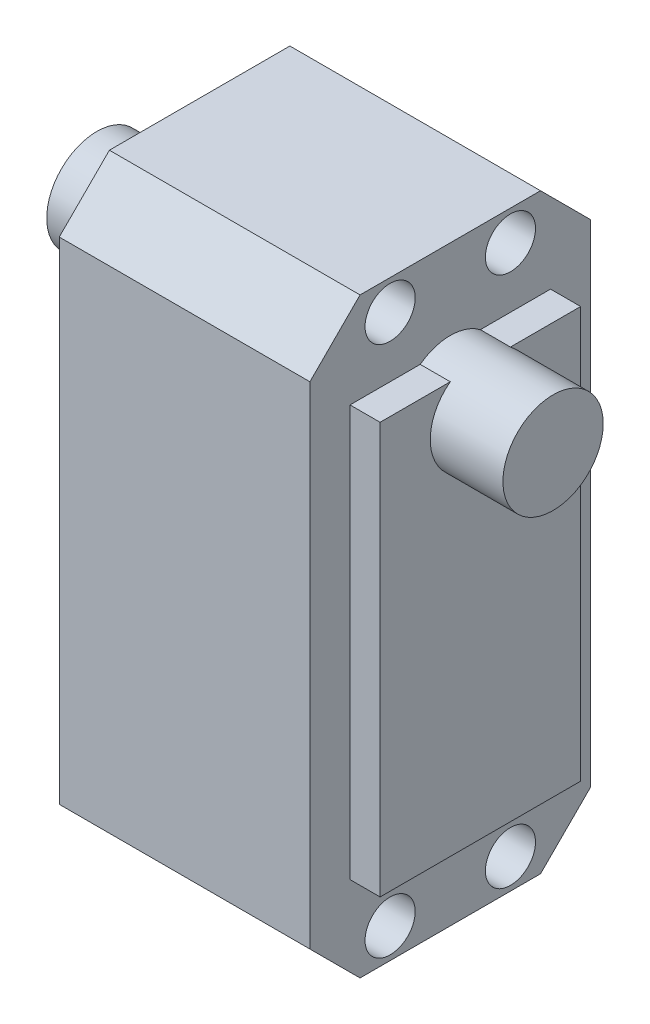
ISO-10303-21;
HEADER;
FILE_DESCRIPTION(('STEP AP214'),'2;1');
FILE_NAME('part.step','',(''),(''),'','','');
FILE_SCHEMA(('AUTOMOTIVE_DESIGN { 1 0 10303 214 1 1 1 1 }'));
ENDSEC;
DATA;
#1=APPLICATION_CONTEXT('core data for automotive mechanical design processes');
#2=APPLICATION_PROTOCOL_DEFINITION('international standard','automotive_design',2000,#1);
#3=PRODUCT_CONTEXT('',#1,'mechanical');
#4=PRODUCT('Part','Part','',(#3));
#5=PRODUCT_RELATED_PRODUCT_CATEGORY('part','',(#4));
#6=PRODUCT_DEFINITION_FORMATION('','',#4);
#7=PRODUCT_DEFINITION_CONTEXT('part definition',#1,'design');
#8=PRODUCT_DEFINITION('design','',#6,#7);
#9=PRODUCT_DEFINITION_SHAPE('','',#8);
#10=(LENGTH_UNIT() NAMED_UNIT(*) SI_UNIT(.MILLI.,.METRE.));
#11=(NAMED_UNIT(*) PLANE_ANGLE_UNIT() SI_UNIT($,.RADIAN.));
#12=(NAMED_UNIT(*) SI_UNIT($,.STERADIAN.) SOLID_ANGLE_UNIT());
#13=UNCERTAINTY_MEASURE_WITH_UNIT(LENGTH_MEASURE(1.E-05),#10,'distance_accuracy_value','');
#14=(GEOMETRIC_REPRESENTATION_CONTEXT(3) GLOBAL_UNCERTAINTY_ASSIGNED_CONTEXT((#13)) GLOBAL_UNIT_ASSIGNED_CONTEXT((#10,
#11,#12)) REPRESENTATION_CONTEXT('',''));
#15=CARTESIAN_POINT('',(0.,0.,0.));
#16=DIRECTION('',(0.,0.,1.));
#17=DIRECTION('',(1.,0.,0.));
#18=AXIS2_PLACEMENT_3D('',#15,#16,#17);
#19=CARTESIAN_POINT('',(0.,0.,2.8));
#20=DIRECTION('',(1.,0.,0.));
#21=DIRECTION('',(0.,0.,-1.));
#22=AXIS2_PLACEMENT_3D('',#19,#20,#21);
#23=PLANE('',#22);
#24=DIRECTION('',(0.,0.,-1.));
#25=VECTOR('',#24,1.);
#26=CARTESIAN_POINT('',(0.,0.2,0.));
#27=LINE('',#26,#25);
#28=CARTESIAN_POINT('',(0.,0.2,2.3));
#29=VERTEX_POINT('',#28);
#30=CARTESIAN_POINT('',(0.,0.2,0.5));
#31=VERTEX_POINT('',#30);
#32=EDGE_CURVE('E183',#29,#31,#27,.T.);
#33=ORIENTED_EDGE('',*,*,#32,.F.);
#34=DIRECTION('',(0.,-0.707106781186548,-0.707106781186548));
#35=VECTOR('',#34,1.);
#36=CARTESIAN_POINT('',(0.,0.7,2.8));
#37=LINE('',#36,#35);
#38=CARTESIAN_POINT('',(0.,0.7,2.8));
#39=VERTEX_POINT('',#38);
#40=EDGE_CURVE('E48',#39,#29,#37,.T.);
#41=ORIENTED_EDGE('',*,*,#40,.F.);
#42=DIRECTION('',(0.,-1.,0.));
#43=VECTOR('',#42,1.);
#44=CARTESIAN_POINT('',(0.,0.,2.8));
#45=LINE('',#44,#43);
#46=CARTESIAN_POINT('',(0.,5.6,2.8));
#47=VERTEX_POINT('',#46);
#48=EDGE_CURVE('E181',#47,#39,#45,.T.);
#49=ORIENTED_EDGE('',*,*,#48,.F.);
#50=DIRECTION('',(0.,-0.707106781186547,0.707106781186548));
#51=VECTOR('',#50,1.);
#52=CARTESIAN_POINT('',(0.,6.1,2.3));
#53=LINE('',#52,#51);
#54=CARTESIAN_POINT('',(0.,6.1,2.3));
#55=VERTEX_POINT('',#54);
#56=EDGE_CURVE('E250',#55,#47,#53,.T.);
#57=ORIENTED_EDGE('',*,*,#56,.F.);
#58=DIRECTION('',(0.,0.,1.));
#59=VECTOR('',#58,1.);
#60=CARTESIAN_POINT('',(0.,6.1,0.));
#61=LINE('',#60,#59);
#62=CARTESIAN_POINT('',(0.,6.1,0.5));
#63=VERTEX_POINT('',#62);
#64=EDGE_CURVE('E258',#63,#55,#61,.T.);
#65=ORIENTED_EDGE('',*,*,#64,.F.);
#66=DIRECTION('',(0.,0.707106781186547,0.707106781186548));
#67=VECTOR('',#66,1.);
#68=CARTESIAN_POINT('',(0.,6.1,0.5));
#69=LINE('',#68,#67);
#70=CARTESIAN_POINT('',(0.,5.6,0.));
#71=VERTEX_POINT('',#70);
#72=EDGE_CURVE('E243',#71,#63,#69,.T.);
#73=ORIENTED_EDGE('',*,*,#72,.F.);
#74=DIRECTION('',(0.,-1.,0.));
#75=VECTOR('',#74,1.);
#76=CARTESIAN_POINT('',(0.,0.,0.));
#77=LINE('',#76,#75);
#78=CARTESIAN_POINT('',(0.,0.7,0.));
#79=VERTEX_POINT('',#78);
#80=EDGE_CURVE('E194',#71,#79,#77,.T.);
#81=ORIENTED_EDGE('',*,*,#80,.T.);
#82=DIRECTION('',(0.,0.707106781186547,-0.707106781186548));
#83=VECTOR('',#82,1.);
#84=CARTESIAN_POINT('',(0.,0.7,0.));
#85=LINE('',#84,#83);
#86=EDGE_CURVE('E232',#31,#79,#85,.T.);
#87=ORIENTED_EDGE('',*,*,#86,.F.);
#88=EDGE_LOOP('',(#33,#41,#49,#57,#65,#73,#81,#87));
#89=FACE_BOUND('',#88,.T.);
#90=CARTESIAN_POINT('',(0.,0.5,2.));
#91=DIRECTION('',(-1.,0.,0.));
#92=DIRECTION('',(0.,0.,1.));
#93=AXIS2_PLACEMENT_3D('',#90,#91,#92);
#94=CIRCLE('',#93,0.25);
#95=CARTESIAN_POINT('',(0.,0.5,2.25));
#96=VERTEX_POINT('',#95);
#97=EDGE_CURVE('E206',#96,#96,#94,.T.);
#98=ORIENTED_EDGE('',*,*,#97,.F.);
#99=EDGE_LOOP('',(#98));
#100=FACE_BOUND('',#99,.T.);
#101=CARTESIAN_POINT('',(0.,0.5,0.8));
#102=DIRECTION('',(-1.,0.,0.));
#103=DIRECTION('',(0.,0.,1.));
#104=AXIS2_PLACEMENT_3D('',#101,#102,#103);
#105=CIRCLE('',#104,0.25);
#106=CARTESIAN_POINT('',(0.,0.5,1.05));
#107=VERTEX_POINT('',#106);
#108=EDGE_CURVE('E210',#107,#107,#105,.T.);
#109=ORIENTED_EDGE('',*,*,#108,.F.);
#110=EDGE_LOOP('',(#109));
#111=FACE_BOUND('',#110,.T.);
#112=CARTESIAN_POINT('',(0.,5.8,2.));
#113=DIRECTION('',(-1.,0.,0.));
#114=DIRECTION('',(0.,0.,1.));
#115=AXIS2_PLACEMENT_3D('',#112,#113,#114);
#116=CIRCLE('',#115,0.25);
#117=CARTESIAN_POINT('',(0.,5.8,2.25));
#118=VERTEX_POINT('',#117);
#119=EDGE_CURVE('E214',#118,#118,#116,.T.);
#120=ORIENTED_EDGE('',*,*,#119,.F.);
#121=EDGE_LOOP('',(#120));
#122=FACE_BOUND('',#121,.T.);
#123=CARTESIAN_POINT('',(0.,5.8,0.8));
#124=DIRECTION('',(-1.,0.,0.));
#125=DIRECTION('',(0.,0.,1.));
#126=AXIS2_PLACEMENT_3D('',#123,#124,#125);
#127=CIRCLE('',#126,0.25);
#128=CARTESIAN_POINT('',(0.,5.8,1.05));
#129=VERTEX_POINT('',#128);
#130=EDGE_CURVE('E218',#129,#129,#127,.T.);
#131=ORIENTED_EDGE('',*,*,#130,.F.);
#132=EDGE_LOOP('',(#131));
#133=FACE_BOUND('',#132,.T.);
#134=CARTESIAN_POINT('',(0.,4.8,1.4));
#135=DIRECTION('',(1.,0.,0.));
#136=DIRECTION('',(0.,0.,-1.));
#137=AXIS2_PLACEMENT_3D('',#134,#135,#136);
#138=CIRCLE('',#137,0.5);
#139=CARTESIAN_POINT('',(0.,5.2,1.7));
#140=VERTEX_POINT('',#139);
#141=CARTESIAN_POINT('',(0.,5.2,1.1));
#142=VERTEX_POINT('',#141);
#143=EDGE_CURVE('E274',#140,#142,#138,.F.);
#144=ORIENTED_EDGE('',*,*,#143,.F.);
#145=DIRECTION('',(0.,0.,-1.));
#146=VECTOR('',#145,1.);
#147=CARTESIAN_POINT('',(0.,5.2,0.4));
#148=LINE('',#147,#146);
#149=CARTESIAN_POINT('',(0.,5.2,2.4));
#150=VERTEX_POINT('',#149);
#151=EDGE_CURVE('E307',#150,#140,#148,.T.);
#152=ORIENTED_EDGE('',*,*,#151,.F.);
#153=DIRECTION('',(0.,1.,0.));
#154=VECTOR('',#153,1.);
#155=CARTESIAN_POINT('',(0.,5.2,2.4));
#156=LINE('',#155,#154);
#157=CARTESIAN_POINT('',(0.,1.1,2.4));
#158=VERTEX_POINT('',#157);
#159=EDGE_CURVE('E316',#158,#150,#156,.T.);
#160=ORIENTED_EDGE('',*,*,#159,.F.);
#161=DIRECTION('',(0.,0.,1.));
#162=VECTOR('',#161,1.);
#163=CARTESIAN_POINT('',(0.,1.1,0.400000000000001));
#164=LINE('',#163,#162);
#165=CARTESIAN_POINT('',(0.,1.1,0.400000000000001));
#166=VERTEX_POINT('',#165);
#167=EDGE_CURVE('E313',#166,#158,#164,.T.);
#168=ORIENTED_EDGE('',*,*,#167,.F.);
#169=DIRECTION('',(0.,-1.,0.));
#170=VECTOR('',#169,1.);
#171=CARTESIAN_POINT('',(0.,5.2,0.4));
#172=LINE('',#171,#170);
#173=CARTESIAN_POINT('',(0.,5.2,0.4));
#174=VERTEX_POINT('',#173);
#175=EDGE_CURVE('E310',#174,#166,#172,.T.);
#176=ORIENTED_EDGE('',*,*,#175,.F.);
#177=EDGE_CURVE('E205',#142,#174,#148,.T.);
#178=ORIENTED_EDGE('',*,*,#177,.F.);
#179=EDGE_LOOP('',(#144,#152,#160,#168,#176,#178));
#180=FACE_BOUND('',#179,.T.);
#181=ADVANCED_FACE('F34',(#89,#100,#111,#122,#133,#180),#23,.F.);
#182=CARTESIAN_POINT('',(2.5,0.,2.8));
#183=DIRECTION('',(-1.,0.,0.));
#184=DIRECTION('',(0.,0.,1.));
#185=AXIS2_PLACEMENT_3D('',#182,#183,#184);
#186=PLANE('',#185);
#187=DIRECTION('',(0.,1.,0.));
#188=VECTOR('',#187,1.);
#189=CARTESIAN_POINT('',(2.5,0.,2.8));
#190=LINE('',#189,#188);
#191=CARTESIAN_POINT('',(2.5,0.7,2.8));
#192=VERTEX_POINT('',#191);
#193=CARTESIAN_POINT('',(2.5,5.6,2.8));
#194=VERTEX_POINT('',#193);
#195=EDGE_CURVE('E189',#192,#194,#190,.T.);
#196=ORIENTED_EDGE('',*,*,#195,.F.);
#197=DIRECTION('',(0.,-0.707106781186548,-0.707106781186548));
#198=VECTOR('',#197,1.);
#199=CARTESIAN_POINT('',(2.5,0.35,2.45));
#200=LINE('',#199,#198);
#201=CARTESIAN_POINT('',(2.5,0.2,2.3));
#202=VERTEX_POINT('',#201);
#203=EDGE_CURVE('E171',#192,#202,#200,.T.);
#204=ORIENTED_EDGE('',*,*,#203,.T.);
#205=DIRECTION('',(0.,0.,-1.));
#206=VECTOR('',#205,1.);
#207=CARTESIAN_POINT('',(2.5,0.2,2.8));
#208=LINE('',#207,#206);
#209=CARTESIAN_POINT('',(2.5,0.2,0.5));
#210=VERTEX_POINT('',#209);
#211=EDGE_CURVE('E55',#202,#210,#208,.T.);
#212=ORIENTED_EDGE('',*,*,#211,.T.);
#213=DIRECTION('',(0.,0.707106781186547,-0.707106781186548));
#214=VECTOR('',#213,1.);
#215=CARTESIAN_POINT('',(2.5,-1.05,1.75));
#216=LINE('',#215,#214);
#217=CARTESIAN_POINT('',(2.5,0.7,0.));
#218=VERTEX_POINT('',#217);
#219=EDGE_CURVE('E234',#210,#218,#216,.T.);
#220=ORIENTED_EDGE('',*,*,#219,.T.);
#221=DIRECTION('',(0.,1.,0.));
#222=VECTOR('',#221,1.);
#223=CARTESIAN_POINT('',(2.5,0.,0.));
#224=LINE('',#223,#222);
#225=CARTESIAN_POINT('',(2.5,5.6,0.));
#226=VERTEX_POINT('',#225);
#227=EDGE_CURVE('E190',#218,#226,#224,.T.);
#228=ORIENTED_EDGE('',*,*,#227,.T.);
#229=DIRECTION('',(0.,0.707106781186547,0.707106781186548));
#230=VECTOR('',#229,1.);
#231=CARTESIAN_POINT('',(2.5,4.2,-1.4));
#232=LINE('',#231,#230);
#233=CARTESIAN_POINT('',(2.5,6.1,0.5));
#234=VERTEX_POINT('',#233);
#235=EDGE_CURVE('E247',#226,#234,#232,.T.);
#236=ORIENTED_EDGE('',*,*,#235,.T.);
#237=DIRECTION('',(0.,0.,1.));
#238=VECTOR('',#237,1.);
#239=CARTESIAN_POINT('',(2.5,6.1,2.8));
#240=LINE('',#239,#238);
#241=CARTESIAN_POINT('',(2.5,6.1,2.3));
#242=VERTEX_POINT('',#241);
#243=EDGE_CURVE('E260',#234,#242,#240,.T.);
#244=ORIENTED_EDGE('',*,*,#243,.T.);
#245=DIRECTION('',(0.,-0.707106781186547,0.707106781186548));
#246=VECTOR('',#245,1.);
#247=CARTESIAN_POINT('',(2.5,2.8,5.6));
#248=LINE('',#247,#246);
#249=EDGE_CURVE('E253',#242,#194,#248,.T.);
#250=ORIENTED_EDGE('',*,*,#249,.T.);
#251=EDGE_LOOP('',(#196,#204,#212,#220,#228,#236,#244,#250));
#252=FACE_BOUND('',#251,.T.);
#253=CARTESIAN_POINT('',(2.5,0.5,2.));
#254=DIRECTION('',(-1.,0.,0.));
#255=DIRECTION('',(0.,0.,1.));
#256=AXIS2_PLACEMENT_3D('',#253,#254,#255);
#257=CIRCLE('',#256,0.25);
#258=CARTESIAN_POINT('',(2.5,0.5,2.25));
#259=VERTEX_POINT('',#258);
#260=EDGE_CURVE('E202',#259,#259,#257,.T.);
#261=ORIENTED_EDGE('',*,*,#260,.T.);
#262=EDGE_LOOP('',(#261));
#263=FACE_BOUND('',#262,.T.);
#264=CARTESIAN_POINT('',(2.5,0.5,0.8));
#265=DIRECTION('',(-1.,0.,0.));
#266=DIRECTION('',(0.,0.,1.));
#267=AXIS2_PLACEMENT_3D('',#264,#265,#266);
#268=CIRCLE('',#267,0.25);
#269=CARTESIAN_POINT('',(2.5,0.5,1.05));
#270=VERTEX_POINT('',#269);
#271=EDGE_CURVE('E207',#270,#270,#268,.T.);
#272=ORIENTED_EDGE('',*,*,#271,.T.);
#273=EDGE_LOOP('',(#272));
#274=FACE_BOUND('',#273,.T.);
#275=CARTESIAN_POINT('',(2.5,5.8,2.));
#276=DIRECTION('',(-1.,0.,0.));
#277=DIRECTION('',(0.,0.,1.));
#278=AXIS2_PLACEMENT_3D('',#275,#276,#277);
#279=CIRCLE('',#278,0.25);
#280=CARTESIAN_POINT('',(2.5,5.8,2.25));
#281=VERTEX_POINT('',#280);
#282=EDGE_CURVE('E211',#281,#281,#279,.T.);
#283=ORIENTED_EDGE('',*,*,#282,.T.);
#284=EDGE_LOOP('',(#283));
#285=FACE_BOUND('',#284,.T.);
#286=CARTESIAN_POINT('',(2.5,5.8,0.8));
#287=DIRECTION('',(-1.,0.,0.));
#288=DIRECTION('',(0.,0.,1.));
#289=AXIS2_PLACEMENT_3D('',#286,#287,#288);
#290=CIRCLE('',#289,0.25);
#291=CARTESIAN_POINT('',(2.5,5.8,1.05));
#292=VERTEX_POINT('',#291);
#293=EDGE_CURVE('E215',#292,#292,#290,.T.);
#294=ORIENTED_EDGE('',*,*,#293,.T.);
#295=EDGE_LOOP('',(#294));
#296=FACE_BOUND('',#295,.T.);
#297=CARTESIAN_POINT('',(2.5,4.8,1.4));
#298=DIRECTION('',(-1.,0.,0.));
#299=DIRECTION('',(0.,0.,1.));
#300=AXIS2_PLACEMENT_3D('',#297,#298,#299);
#301=CIRCLE('',#300,0.5);
#302=CARTESIAN_POINT('',(2.5,5.2,1.1));
#303=VERTEX_POINT('',#302);
#304=CARTESIAN_POINT('',(2.5,5.2,1.7));
#305=VERTEX_POINT('',#304);
#306=EDGE_CURVE('E286',#303,#305,#301,.F.);
#307=ORIENTED_EDGE('',*,*,#306,.F.);
#308=DIRECTION('',(0.,0.,1.));
#309=VECTOR('',#308,1.);
#310=CARTESIAN_POINT('',(2.5,5.2,2.4));
#311=LINE('',#310,#309);
#312=CARTESIAN_POINT('',(2.5,5.2,0.4));
#313=VERTEX_POINT('',#312);
#314=EDGE_CURVE('E341',#313,#303,#311,.T.);
#315=ORIENTED_EDGE('',*,*,#314,.F.);
#316=DIRECTION('',(0.,1.,0.));
#317=VECTOR('',#316,1.);
#318=CARTESIAN_POINT('',(2.5,5.2,0.4));
#319=LINE('',#318,#317);
#320=CARTESIAN_POINT('',(2.5,1.1,0.399999999999999));
#321=VERTEX_POINT('',#320);
#322=EDGE_CURVE('E350',#321,#313,#319,.T.);
#323=ORIENTED_EDGE('',*,*,#322,.F.);
#324=DIRECTION('',(0.,0.,-1.));
#325=VECTOR('',#324,1.);
#326=CARTESIAN_POINT('',(2.5,1.1,2.4));
#327=LINE('',#326,#325);
#328=CARTESIAN_POINT('',(2.5,1.1,2.4));
#329=VERTEX_POINT('',#328);
#330=EDGE_CURVE('E347',#329,#321,#327,.T.);
#331=ORIENTED_EDGE('',*,*,#330,.F.);
#332=DIRECTION('',(0.,-1.,0.));
#333=VECTOR('',#332,1.);
#334=CARTESIAN_POINT('',(2.5,5.2,2.4));
#335=LINE('',#334,#333);
#336=CARTESIAN_POINT('',(2.5,5.2,2.4));
#337=VERTEX_POINT('',#336);
#338=EDGE_CURVE('E344',#337,#329,#335,.T.);
#339=ORIENTED_EDGE('',*,*,#338,.F.);
#340=EDGE_CURVE('E330',#305,#337,#311,.T.);
#341=ORIENTED_EDGE('',*,*,#340,.F.);
#342=EDGE_LOOP('',(#307,#315,#323,#331,#339,#341));
#343=FACE_BOUND('',#342,.T.);
#344=ADVANCED_FACE('F373',(#252,#263,#274,#285,#296,#343),#186,.F.);
#345=CARTESIAN_POINT('',(2.8,5.2,2.4));
#346=DIRECTION('',(0.,-1.,0.));
#347=DIRECTION('',(0.,0.,-1.));
#348=AXIS2_PLACEMENT_3D('',#345,#346,#347);
#349=PLANE('',#348);
#350=DIRECTION('',(-1.,0.,0.));
#351=VECTOR('',#350,1.);
#352=CARTESIAN_POINT('',(3.525,5.2,1.7));
#353=LINE('',#352,#351);
#354=CARTESIAN_POINT('',(2.8,5.2,1.7));
#355=VERTEX_POINT('',#354);
#356=EDGE_CURVE('E283',#305,#355,#353,.F.);
#357=ORIENTED_EDGE('',*,*,#356,.F.);
#358=ORIENTED_EDGE('',*,*,#340,.T.);
#359=DIRECTION('',(-1.,0.,0.));
#360=VECTOR('',#359,1.);
#361=CARTESIAN_POINT('',(2.8,5.2,2.4));
#362=LINE('',#361,#360);
#363=CARTESIAN_POINT('',(2.8,5.2,2.4));
#364=VERTEX_POINT('',#363);
#365=EDGE_CURVE('E197',#364,#337,#362,.T.);
#366=ORIENTED_EDGE('',*,*,#365,.F.);
#367=DIRECTION('',(0.,0.,1.));
#368=VECTOR('',#367,1.);
#369=CARTESIAN_POINT('',(2.8,5.2,2.4));
#370=LINE('',#369,#368);
#371=EDGE_CURVE('E334',#355,#364,#370,.T.);
#372=ORIENTED_EDGE('',*,*,#371,.F.);
#373=EDGE_LOOP('',(#357,#358,#366,#372));
#374=FACE_BOUND('',#373,.T.);
#375=ADVANCED_FACE('F370',(#374),#349,.F.);
#376=DIRECTION('',(-1.,0.,0.));
#377=VECTOR('',#376,1.);
#378=CARTESIAN_POINT('',(3.525,5.2,1.1));
#379=LINE('',#378,#377);
#380=CARTESIAN_POINT('',(2.8,5.2,1.1));
#381=VERTEX_POINT('',#380);
#382=EDGE_CURVE('E280',#381,#303,#379,.T.);
#383=ORIENTED_EDGE('',*,*,#382,.F.);
#384=CARTESIAN_POINT('',(2.8,5.2,0.4));
#385=VERTEX_POINT('',#384);
#386=EDGE_CURVE('E331',#385,#381,#370,.T.);
#387=ORIENTED_EDGE('',*,*,#386,.F.);
#388=DIRECTION('',(-1.,0.,0.));
#389=VECTOR('',#388,1.);
#390=CARTESIAN_POINT('',(2.8,5.2,0.4));
#391=LINE('',#390,#389);
#392=EDGE_CURVE('E340',#385,#313,#391,.T.);
#393=ORIENTED_EDGE('',*,*,#392,.T.);
#394=ORIENTED_EDGE('',*,*,#314,.T.);
#395=EDGE_LOOP('',(#383,#387,#393,#394));
#396=FACE_BOUND('',#395,.T.);
#397=ADVANCED_FACE('F387',(#396),#349,.F.);
#398=CARTESIAN_POINT('',(2.8,0.,0.));
#399=DIRECTION('',(-1.,0.,0.));
#400=DIRECTION('',(0.,0.,1.));
#401=AXIS2_PLACEMENT_3D('',#398,#399,#400);
#402=PLANE('',#401);
#403=CARTESIAN_POINT('',(2.8,4.8,1.4));
#404=DIRECTION('',(-1.,0.,0.));
#405=DIRECTION('',(0.,0.,1.));
#406=AXIS2_PLACEMENT_3D('',#403,#404,#405);
#407=CIRCLE('',#406,0.5);
#408=EDGE_CURVE('E277',#355,#381,#407,.F.);
#409=ORIENTED_EDGE('',*,*,#408,.F.);
#410=ORIENTED_EDGE('',*,*,#371,.T.);
#411=DIRECTION('',(0.,-1.,0.));
#412=VECTOR('',#411,1.);
#413=CARTESIAN_POINT('',(2.8,5.2,2.4));
#414=LINE('',#413,#412);
#415=CARTESIAN_POINT('',(2.8,1.1,2.4));
#416=VERTEX_POINT('',#415);
#417=EDGE_CURVE('E333',#364,#416,#414,.T.);
#418=ORIENTED_EDGE('',*,*,#417,.T.);
#419=DIRECTION('',(0.,0.,-1.));
#420=VECTOR('',#419,1.);
#421=CARTESIAN_POINT('',(2.8,1.1,2.4));
#422=LINE('',#421,#420);
#423=CARTESIAN_POINT('',(2.8,1.1,0.399999999999999));
#424=VERTEX_POINT('',#423);
#425=EDGE_CURVE('E336',#416,#424,#422,.T.);
#426=ORIENTED_EDGE('',*,*,#425,.T.);
#427=DIRECTION('',(0.,1.,0.));
#428=VECTOR('',#427,1.);
#429=CARTESIAN_POINT('',(2.8,5.2,0.4));
#430=LINE('',#429,#428);
#431=EDGE_CURVE('E338',#424,#385,#430,.T.);
#432=ORIENTED_EDGE('',*,*,#431,.T.);
#433=ORIENTED_EDGE('',*,*,#386,.T.);
#434=EDGE_LOOP('',(#409,#410,#418,#426,#432,#433));
#435=FACE_BOUND('',#434,.T.);
#436=ADVANCED_FACE('F382',(#435),#402,.F.);
#437=CARTESIAN_POINT('',(-0.3,5.2,0.4));
#438=DIRECTION('',(0.,-1.,0.));
#439=DIRECTION('',(0.,0.,-1.));
#440=AXIS2_PLACEMENT_3D('',#437,#438,#439);
#441=PLANE('',#440);
#442=DIRECTION('',(-1.,0.,0.));
#443=VECTOR('',#442,1.);
#444=CARTESIAN_POINT('',(3.525,5.2,1.7));
#445=LINE('',#444,#443);
#446=CARTESIAN_POINT('',(-0.3,5.2,1.7));
#447=VERTEX_POINT('',#446);
#448=EDGE_CURVE('E271',#447,#140,#445,.F.);
#449=ORIENTED_EDGE('',*,*,#448,.F.);
#450=DIRECTION('',(0.,0.,-1.));
#451=VECTOR('',#450,1.);
#452=CARTESIAN_POINT('',(-0.3,5.2,0.4));
#453=LINE('',#452,#451);
#454=CARTESIAN_POINT('',(-0.3,5.2,2.4));
#455=VERTEX_POINT('',#454);
#456=EDGE_CURVE('E297',#455,#447,#453,.T.);
#457=ORIENTED_EDGE('',*,*,#456,.F.);
#458=DIRECTION('',(1.,0.,0.));
#459=VECTOR('',#458,1.);
#460=CARTESIAN_POINT('',(-0.3,5.2,2.4));
#461=LINE('',#460,#459);
#462=EDGE_CURVE('E306',#455,#150,#461,.T.);
#463=ORIENTED_EDGE('',*,*,#462,.T.);
#464=ORIENTED_EDGE('',*,*,#151,.T.);
#465=EDGE_LOOP('',(#449,#457,#463,#464));
#466=FACE_BOUND('',#465,.T.);
#467=ADVANCED_FACE('F394',(#466),#441,.F.);
#468=DIRECTION('',(-1.,0.,0.));
#469=VECTOR('',#468,1.);
#470=CARTESIAN_POINT('',(3.525,5.2,1.1));
#471=LINE('',#470,#469);
#472=CARTESIAN_POINT('',(-0.3,5.2,1.1));
#473=VERTEX_POINT('',#472);
#474=EDGE_CURVE('E266',#142,#473,#471,.T.);
#475=ORIENTED_EDGE('',*,*,#474,.F.);
#476=ORIENTED_EDGE('',*,*,#177,.T.);
#477=DIRECTION('',(1.,0.,0.));
#478=VECTOR('',#477,1.);
#479=CARTESIAN_POINT('',(-0.3,5.2,0.4));
#480=LINE('',#479,#478);
#481=CARTESIAN_POINT('',(-0.3,5.2,0.4));
#482=VERTEX_POINT('',#481);
#483=EDGE_CURVE('E327',#482,#174,#480,.T.);
#484=ORIENTED_EDGE('',*,*,#483,.F.);
#485=EDGE_CURVE('E300',#473,#482,#453,.T.);
#486=ORIENTED_EDGE('',*,*,#485,.F.);
#487=EDGE_LOOP('',(#475,#476,#484,#486));
#488=FACE_BOUND('',#487,.T.);
#489=ADVANCED_FACE('F415',(#488),#441,.F.);
#490=CARTESIAN_POINT('',(-0.3,0.,0.));
#491=DIRECTION('',(1.,0.,0.));
#492=DIRECTION('',(0.,0.,-1.));
#493=AXIS2_PLACEMENT_3D('',#490,#491,#492);
#494=PLANE('',#493);
#495=CARTESIAN_POINT('',(-0.3,4.8,1.4));
#496=DIRECTION('',(1.,0.,0.));
#497=DIRECTION('',(0.,0.,-1.));
#498=AXIS2_PLACEMENT_3D('',#495,#496,#497);
#499=CIRCLE('',#498,0.5);
#500=EDGE_CURVE('E192',#473,#447,#499,.F.);
#501=ORIENTED_EDGE('',*,*,#500,.F.);
#502=ORIENTED_EDGE('',*,*,#485,.T.);
#503=DIRECTION('',(0.,-1.,0.));
#504=VECTOR('',#503,1.);
#505=CARTESIAN_POINT('',(-0.3,5.2,0.4));
#506=LINE('',#505,#504);
#507=CARTESIAN_POINT('',(-0.3,1.1,0.400000000000001));
#508=VERTEX_POINT('',#507);
#509=EDGE_CURVE('E299',#482,#508,#506,.T.);
#510=ORIENTED_EDGE('',*,*,#509,.T.);
#511=DIRECTION('',(0.,0.,1.));
#512=VECTOR('',#511,1.);
#513=CARTESIAN_POINT('',(-0.3,1.1,0.400000000000001));
#514=LINE('',#513,#512);
#515=CARTESIAN_POINT('',(-0.3,1.1,2.4));
#516=VERTEX_POINT('',#515);
#517=EDGE_CURVE('E302',#508,#516,#514,.T.);
#518=ORIENTED_EDGE('',*,*,#517,.T.);
#519=DIRECTION('',(0.,1.,0.));
#520=VECTOR('',#519,1.);
#521=CARTESIAN_POINT('',(-0.3,5.2,2.4));
#522=LINE('',#521,#520);
#523=EDGE_CURVE('E304',#516,#455,#522,.T.);
#524=ORIENTED_EDGE('',*,*,#523,.T.);
#525=ORIENTED_EDGE('',*,*,#456,.T.);
#526=EDGE_LOOP('',(#501,#502,#510,#518,#524,#525));
#527=FACE_BOUND('',#526,.T.);
#528=ADVANCED_FACE('F411',(#527),#494,.F.);
#529=CARTESIAN_POINT('',(0.,0.,2.8));
#530=DIRECTION('',(0.,0.,-1.));
#531=DIRECTION('',(-1.,0.,0.));
#532=AXIS2_PLACEMENT_3D('',#529,#530,#531);
#533=PLANE('',#532);
#534=ORIENTED_EDGE('',*,*,#48,.T.);
#535=DIRECTION('',(-1.,0.,0.));
#536=VECTOR('',#535,1.);
#537=CARTESIAN_POINT('',(10.,0.7,2.8));
#538=LINE('',#537,#536);
#539=EDGE_CURVE('E169',#192,#39,#538,.T.);
#540=ORIENTED_EDGE('',*,*,#539,.F.);
#541=ORIENTED_EDGE('',*,*,#195,.T.);
#542=DIRECTION('',(-1.,0.,0.));
#543=VECTOR('',#542,1.);
#544=CARTESIAN_POINT('',(10.,5.6,2.8));
#545=LINE('',#544,#543);
#546=EDGE_CURVE('E188',#194,#47,#545,.T.);
#547=ORIENTED_EDGE('',*,*,#546,.T.);
#548=EDGE_LOOP('',(#534,#540,#541,#547));
#549=FACE_BOUND('',#548,.T.);
#550=ADVANCED_FACE('F186',(#549),#533,.F.);
#551=CARTESIAN_POINT('',(0.,0.,0.));
#552=DIRECTION('',(0.,0.,-1.));
#553=DIRECTION('',(-1.,0.,0.));
#554=AXIS2_PLACEMENT_3D('',#551,#552,#553);
#555=PLANE('',#554);
#556=DIRECTION('',(-1.,0.,0.));
#557=VECTOR('',#556,1.);
#558=CARTESIAN_POINT('',(10.,0.7,0.));
#559=LINE('',#558,#557);
#560=EDGE_CURVE('E237',#218,#79,#559,.T.);
#561=ORIENTED_EDGE('',*,*,#560,.T.);
#562=ORIENTED_EDGE('',*,*,#80,.F.);
#563=DIRECTION('',(-1.,0.,0.));
#564=VECTOR('',#563,1.);
#565=CARTESIAN_POINT('',(10.,5.6,0.));
#566=LINE('',#565,#564);
#567=EDGE_CURVE('E245',#226,#71,#566,.T.);
#568=ORIENTED_EDGE('',*,*,#567,.F.);
#569=ORIENTED_EDGE('',*,*,#227,.F.);
#570=EDGE_LOOP('',(#561,#562,#568,#569));
#571=FACE_BOUND('',#570,.T.);
#572=ADVANCED_FACE('F408',(#571),#555,.T.);
#573=CARTESIAN_POINT('',(2.8,5.2,2.4));
#574=DIRECTION('',(0.,0.,-1.));
#575=DIRECTION('',(0.,1.,0.));
#576=AXIS2_PLACEMENT_3D('',#573,#574,#575);
#577=PLANE('',#576);
#578=ORIENTED_EDGE('',*,*,#338,.T.);
#579=DIRECTION('',(-1.,0.,0.));
#580=VECTOR('',#579,1.);
#581=CARTESIAN_POINT('',(2.8,1.1,2.4));
#582=LINE('',#581,#580);
#583=EDGE_CURVE('E357',#416,#329,#582,.T.);
#584=ORIENTED_EDGE('',*,*,#583,.F.);
#585=ORIENTED_EDGE('',*,*,#417,.F.);
#586=ORIENTED_EDGE('',*,*,#365,.T.);
#587=EDGE_LOOP('',(#578,#584,#585,#586));
#588=FACE_BOUND('',#587,.T.);
#589=ADVANCED_FACE('F366',(#588),#577,.F.);
#590=CARTESIAN_POINT('',(2.8,1.1,2.4));
#591=DIRECTION('',(0.,1.,0.));
#592=DIRECTION('',(0.,0.,1.));
#593=AXIS2_PLACEMENT_3D('',#590,#591,#592);
#594=PLANE('',#593);
#595=ORIENTED_EDGE('',*,*,#330,.T.);
#596=DIRECTION('',(-1.,0.,0.));
#597=VECTOR('',#596,1.);
#598=CARTESIAN_POINT('',(2.8,1.1,0.399999999999999));
#599=LINE('',#598,#597);
#600=EDGE_CURVE('E355',#424,#321,#599,.T.);
#601=ORIENTED_EDGE('',*,*,#600,.F.);
#602=ORIENTED_EDGE('',*,*,#425,.F.);
#603=ORIENTED_EDGE('',*,*,#583,.T.);
#604=EDGE_LOOP('',(#595,#601,#602,#603));
#605=FACE_BOUND('',#604,.T.);
#606=ADVANCED_FACE('F375',(#605),#594,.F.);
#607=CARTESIAN_POINT('',(2.8,5.2,0.4));
#608=DIRECTION('',(0.,0.,1.));
#609=DIRECTION('',(0.,-1.,0.));
#610=AXIS2_PLACEMENT_3D('',#607,#608,#609);
#611=PLANE('',#610);
#612=ORIENTED_EDGE('',*,*,#322,.T.);
#613=ORIENTED_EDGE('',*,*,#392,.F.);
#614=ORIENTED_EDGE('',*,*,#431,.F.);
#615=ORIENTED_EDGE('',*,*,#600,.T.);
#616=EDGE_LOOP('',(#612,#613,#614,#615));
#617=FACE_BOUND('',#616,.T.);
#618=ADVANCED_FACE('F378',(#617),#611,.F.);
#619=CARTESIAN_POINT('',(-0.3,5.2,0.4));
#620=DIRECTION('',(0.,0.,1.));
#621=DIRECTION('',(0.,-1.,0.));
#622=AXIS2_PLACEMENT_3D('',#619,#620,#621);
#623=PLANE('',#622);
#624=ORIENTED_EDGE('',*,*,#175,.T.);
#625=DIRECTION('',(1.,0.,0.));
#626=VECTOR('',#625,1.);
#627=CARTESIAN_POINT('',(-0.3,1.1,0.400000000000001));
#628=LINE('',#627,#626);
#629=EDGE_CURVE('E324',#508,#166,#628,.T.);
#630=ORIENTED_EDGE('',*,*,#629,.F.);
#631=ORIENTED_EDGE('',*,*,#509,.F.);
#632=ORIENTED_EDGE('',*,*,#483,.T.);
#633=EDGE_LOOP('',(#624,#630,#631,#632));
#634=FACE_BOUND('',#633,.T.);
#635=ADVANCED_FACE('F434',(#634),#623,.F.);
#636=CARTESIAN_POINT('',(-0.3,1.1,0.400000000000001));
#637=DIRECTION('',(0.,1.,0.));
#638=DIRECTION('',(0.,0.,1.));
#639=AXIS2_PLACEMENT_3D('',#636,#637,#638);
#640=PLANE('',#639);
#641=ORIENTED_EDGE('',*,*,#167,.T.);
#642=DIRECTION('',(1.,0.,0.));
#643=VECTOR('',#642,1.);
#644=CARTESIAN_POINT('',(-0.3,1.1,2.4));
#645=LINE('',#644,#643);
#646=EDGE_CURVE('E321',#516,#158,#645,.T.);
#647=ORIENTED_EDGE('',*,*,#646,.F.);
#648=ORIENTED_EDGE('',*,*,#517,.F.);
#649=ORIENTED_EDGE('',*,*,#629,.T.);
#650=EDGE_LOOP('',(#641,#647,#648,#649));
#651=FACE_BOUND('',#650,.T.);
#652=ADVANCED_FACE('F430',(#651),#640,.F.);
#653=CARTESIAN_POINT('',(-0.3,5.2,2.4));
#654=DIRECTION('',(0.,0.,-1.));
#655=DIRECTION('',(0.,1.,0.));
#656=AXIS2_PLACEMENT_3D('',#653,#654,#655);
#657=PLANE('',#656);
#658=ORIENTED_EDGE('',*,*,#159,.T.);
#659=ORIENTED_EDGE('',*,*,#462,.F.);
#660=ORIENTED_EDGE('',*,*,#523,.F.);
#661=ORIENTED_EDGE('',*,*,#646,.T.);
#662=EDGE_LOOP('',(#658,#659,#660,#661));
#663=FACE_BOUND('',#662,.T.);
#664=ADVANCED_FACE('F427',(#663),#657,.F.);
#665=CARTESIAN_POINT('',(10.3,0.5,2.));
#666=DIRECTION('',(-1.,0.,0.));
#667=DIRECTION('',(0.,0.,1.));
#668=AXIS2_PLACEMENT_3D('',#665,#666,#667);
#669=CYLINDRICAL_SURFACE('',#668,0.25);
#670=ORIENTED_EDGE('',*,*,#97,.T.);
#671=EDGE_LOOP('',(#670));
#672=FACE_BOUND('',#671,.T.);
#673=ORIENTED_EDGE('',*,*,#260,.F.);
#674=EDGE_LOOP('',(#673));
#675=FACE_BOUND('',#674,.T.);
#676=ADVANCED_FACE('F425',(#672,#675),#669,.F.);
#677=CARTESIAN_POINT('',(10.3,0.5,0.8));
#678=DIRECTION('',(-1.,0.,0.));
#679=DIRECTION('',(0.,0.,1.));
#680=AXIS2_PLACEMENT_3D('',#677,#678,#679);
#681=CYLINDRICAL_SURFACE('',#680,0.25);
#682=ORIENTED_EDGE('',*,*,#108,.T.);
#683=EDGE_LOOP('',(#682));
#684=FACE_BOUND('',#683,.T.);
#685=ORIENTED_EDGE('',*,*,#271,.F.);
#686=EDGE_LOOP('',(#685));
#687=FACE_BOUND('',#686,.T.);
#688=ADVANCED_FACE('F476',(#684,#687),#681,.F.);
#689=CARTESIAN_POINT('',(10.3,5.8,2.));
#690=DIRECTION('',(-1.,0.,0.));
#691=DIRECTION('',(0.,0.,1.));
#692=AXIS2_PLACEMENT_3D('',#689,#690,#691);
#693=CYLINDRICAL_SURFACE('',#692,0.25);
#694=ORIENTED_EDGE('',*,*,#119,.T.);
#695=EDGE_LOOP('',(#694));
#696=FACE_BOUND('',#695,.T.);
#697=ORIENTED_EDGE('',*,*,#282,.F.);
#698=EDGE_LOOP('',(#697));
#699=FACE_BOUND('',#698,.T.);
#700=ADVANCED_FACE('F483',(#696,#699),#693,.F.);
#701=CARTESIAN_POINT('',(10.3,5.8,0.8));
#702=DIRECTION('',(-1.,0.,0.));
#703=DIRECTION('',(0.,0.,1.));
#704=AXIS2_PLACEMENT_3D('',#701,#702,#703);
#705=CYLINDRICAL_SURFACE('',#704,0.25);
#706=ORIENTED_EDGE('',*,*,#130,.T.);
#707=EDGE_LOOP('',(#706));
#708=FACE_BOUND('',#707,.T.);
#709=ORIENTED_EDGE('',*,*,#293,.F.);
#710=EDGE_LOOP('',(#709));
#711=FACE_BOUND('',#710,.T.);
#712=ADVANCED_FACE('F490',(#708,#711),#705,.F.);
#713=CARTESIAN_POINT('',(-1.025,4.8,1.4));
#714=DIRECTION('',(1.,0.,0.));
#715=DIRECTION('',(0.,0.,-1.));
#716=AXIS2_PLACEMENT_3D('',#713,#714,#715);
#717=PLANE('',#716);
#718=CARTESIAN_POINT('',(-1.025,4.8,1.4));
#719=DIRECTION('',(1.,0.,0.));
#720=DIRECTION('',(0.,0.,-1.));
#721=AXIS2_PLACEMENT_3D('',#718,#719,#720);
#722=CIRCLE('',#721,0.5);
#723=CARTESIAN_POINT('',(-1.025,4.8,0.9));
#724=VERTEX_POINT('',#723);
#725=EDGE_CURVE('E262',#724,#724,#722,.T.);
#726=ORIENTED_EDGE('',*,*,#725,.F.);
#727=EDGE_LOOP('',(#726));
#728=FACE_BOUND('',#727,.T.);
#729=ADVANCED_FACE('F498',(#728),#717,.F.);
#730=CARTESIAN_POINT('',(3.525,4.8,1.4));
#731=DIRECTION('',(-1.,0.,0.));
#732=DIRECTION('',(0.,0.,1.));
#733=AXIS2_PLACEMENT_3D('',#730,#731,#732);
#734=CYLINDRICAL_SURFACE('',#733,0.5);
#735=ORIENTED_EDGE('',*,*,#725,.T.);
#736=EDGE_LOOP('',(#735));
#737=FACE_BOUND('',#736,.T.);
#738=ORIENTED_EDGE('',*,*,#448,.T.);
#739=ORIENTED_EDGE('',*,*,#143,.T.);
#740=ORIENTED_EDGE('',*,*,#474,.T.);
#741=ORIENTED_EDGE('',*,*,#500,.T.);
#742=EDGE_LOOP('',(#738,#739,#740,#741));
#743=FACE_BOUND('',#742,.T.);
#744=ADVANCED_FACE('F507',(#737,#743),#734,.T.);
#745=CARTESIAN_POINT('',(3.525,4.8,1.4));
#746=DIRECTION('',(1.,0.,0.));
#747=DIRECTION('',(0.,0.,-1.));
#748=AXIS2_PLACEMENT_3D('',#745,#746,#747);
#749=CIRCLE('',#748,0.5);
#750=CARTESIAN_POINT('',(3.525,4.8,0.9));
#751=VERTEX_POINT('',#750);
#752=EDGE_CURVE('E263',#751,#751,#749,.T.);
#753=ORIENTED_EDGE('',*,*,#752,.F.);
#754=EDGE_LOOP('',(#753));
#755=FACE_BOUND('',#754,.T.);
#756=ORIENTED_EDGE('',*,*,#382,.T.);
#757=ORIENTED_EDGE('',*,*,#306,.T.);
#758=ORIENTED_EDGE('',*,*,#356,.T.);
#759=ORIENTED_EDGE('',*,*,#408,.T.);
#760=EDGE_LOOP('',(#756,#757,#758,#759));
#761=FACE_BOUND('',#760,.T.);
#762=ADVANCED_FACE('F385',(#755,#761),#734,.T.);
#763=CARTESIAN_POINT('',(3.525,4.8,1.4));
#764=DIRECTION('',(1.,0.,0.));
#765=DIRECTION('',(0.,0.,-1.));
#766=AXIS2_PLACEMENT_3D('',#763,#764,#765);
#767=PLANE('',#766);
#768=ORIENTED_EDGE('',*,*,#752,.T.);
#769=EDGE_LOOP('',(#768));
#770=FACE_BOUND('',#769,.T.);
#771=ADVANCED_FACE('F522',(#770),#767,.T.);
#772=CARTESIAN_POINT('',(10.,6.1,0.));
#773=DIRECTION('',(0.,-1.,0.));
#774=DIRECTION('',(0.,0.,-1.));
#775=AXIS2_PLACEMENT_3D('',#772,#773,#774);
#776=PLANE('',#775);
#777=ORIENTED_EDGE('',*,*,#243,.F.);
#778=DIRECTION('',(-1.,0.,0.));
#779=VECTOR('',#778,1.);
#780=CARTESIAN_POINT('',(10.,6.1,0.5));
#781=LINE('',#780,#779);
#782=EDGE_CURVE('E224',#234,#63,#781,.T.);
#783=ORIENTED_EDGE('',*,*,#782,.T.);
#784=ORIENTED_EDGE('',*,*,#64,.T.);
#785=DIRECTION('',(1.,0.,0.));
#786=VECTOR('',#785,1.);
#787=CARTESIAN_POINT('',(10.,6.1,2.3));
#788=LINE('',#787,#786);
#789=EDGE_CURVE('E221',#55,#242,#788,.T.);
#790=ORIENTED_EDGE('',*,*,#789,.T.);
#791=EDGE_LOOP('',(#777,#783,#784,#790));
#792=FACE_BOUND('',#791,.T.);
#793=ADVANCED_FACE('F528',(#792),#776,.F.);
#794=CARTESIAN_POINT('',(10.,0.2,0.));
#795=DIRECTION('',(0.,1.,0.));
#796=DIRECTION('',(0.,0.,1.));
#797=AXIS2_PLACEMENT_3D('',#794,#795,#796);
#798=PLANE('',#797);
#799=ORIENTED_EDGE('',*,*,#211,.F.);
#800=DIRECTION('',(-1.,0.,0.));
#801=VECTOR('',#800,1.);
#802=CARTESIAN_POINT('',(10.,0.2,2.3));
#803=LINE('',#802,#801);
#804=EDGE_CURVE('E11',#202,#29,#803,.T.);
#805=ORIENTED_EDGE('',*,*,#804,.T.);
#806=ORIENTED_EDGE('',*,*,#32,.T.);
#807=DIRECTION('',(1.,0.,0.));
#808=VECTOR('',#807,1.);
#809=CARTESIAN_POINT('',(10.,0.2,0.5));
#810=LINE('',#809,#808);
#811=EDGE_CURVE('E41',#31,#210,#810,.T.);
#812=ORIENTED_EDGE('',*,*,#811,.T.);
#813=EDGE_LOOP('',(#799,#805,#806,#812));
#814=FACE_BOUND('',#813,.T.);
#815=ADVANCED_FACE('F229',(#814),#798,.F.);
#816=CARTESIAN_POINT('',(10.,6.1,2.3));
#817=DIRECTION('',(0.,-0.707106781186548,-0.707106781186547));
#818=DIRECTION('',(0.,0.707106781186547,-0.707106781186548));
#819=AXIS2_PLACEMENT_3D('',#816,#817,#818);
#820=PLANE('',#819);
#821=ORIENTED_EDGE('',*,*,#789,.F.);
#822=ORIENTED_EDGE('',*,*,#56,.T.);
#823=ORIENTED_EDGE('',*,*,#546,.F.);
#824=ORIENTED_EDGE('',*,*,#249,.F.);
#825=EDGE_LOOP('',(#821,#822,#823,#824));
#826=FACE_BOUND('',#825,.T.);
#827=ADVANCED_FACE('F546',(#826),#820,.F.);
#828=CARTESIAN_POINT('',(10.,6.1,0.5));
#829=DIRECTION('',(0.,-0.707106781186548,0.707106781186547));
#830=DIRECTION('',(0.,-0.707106781186547,-0.707106781186548));
#831=AXIS2_PLACEMENT_3D('',#828,#829,#830);
#832=PLANE('',#831);
#833=ORIENTED_EDGE('',*,*,#567,.T.);
#834=ORIENTED_EDGE('',*,*,#72,.T.);
#835=ORIENTED_EDGE('',*,*,#782,.F.);
#836=ORIENTED_EDGE('',*,*,#235,.F.);
#837=EDGE_LOOP('',(#833,#834,#835,#836));
#838=FACE_BOUND('',#837,.T.);
#839=ADVANCED_FACE('F555',(#838),#832,.F.);
#840=CARTESIAN_POINT('',(10.,0.7,0.));
#841=DIRECTION('',(0.,0.707106781186548,0.707106781186547));
#842=DIRECTION('',(0.,-0.707106781186547,0.707106781186548));
#843=AXIS2_PLACEMENT_3D('',#840,#841,#842);
#844=PLANE('',#843);
#845=ORIENTED_EDGE('',*,*,#811,.F.);
#846=ORIENTED_EDGE('',*,*,#86,.T.);
#847=ORIENTED_EDGE('',*,*,#560,.F.);
#848=ORIENTED_EDGE('',*,*,#219,.F.);
#849=EDGE_LOOP('',(#845,#846,#847,#848));
#850=FACE_BOUND('',#849,.T.);
#851=ADVANCED_FACE('F231',(#850),#844,.F.);
#852=CARTESIAN_POINT('',(10.,0.7,2.8));
#853=DIRECTION('',(0.,0.707106781186548,-0.707106781186548));
#854=DIRECTION('',(0.,0.707106781186548,0.707106781186548));
#855=AXIS2_PLACEMENT_3D('',#852,#853,#854);
#856=PLANE('',#855);
#857=ORIENTED_EDGE('',*,*,#539,.T.);
#858=ORIENTED_EDGE('',*,*,#40,.T.);
#859=ORIENTED_EDGE('',*,*,#804,.F.);
#860=ORIENTED_EDGE('',*,*,#203,.F.);
#861=EDGE_LOOP('',(#857,#858,#859,#860));
#862=FACE_BOUND('',#861,.T.);
#863=ADVANCED_FACE('F170',(#862),#856,.F.);
#864=CLOSED_SHELL('',(#181,#344,#375,#397,#436,#467,#489,#528,#550,#572,#589,#606,#618,#635,
#652,#664,#676,#688,#700,#712,#729,#744,#762,#771,#793,#815,#827,#839,#851,#863));
#865=MANIFOLD_SOLID_BREP('B2',#864);
#866=ADVANCED_BREP_SHAPE_REPRESENTATION('',(#18,#865),#14);
#867=SHAPE_DEFINITION_REPRESENTATION(#9,#866);
ENDSEC;
END-ISO-10303-21;
